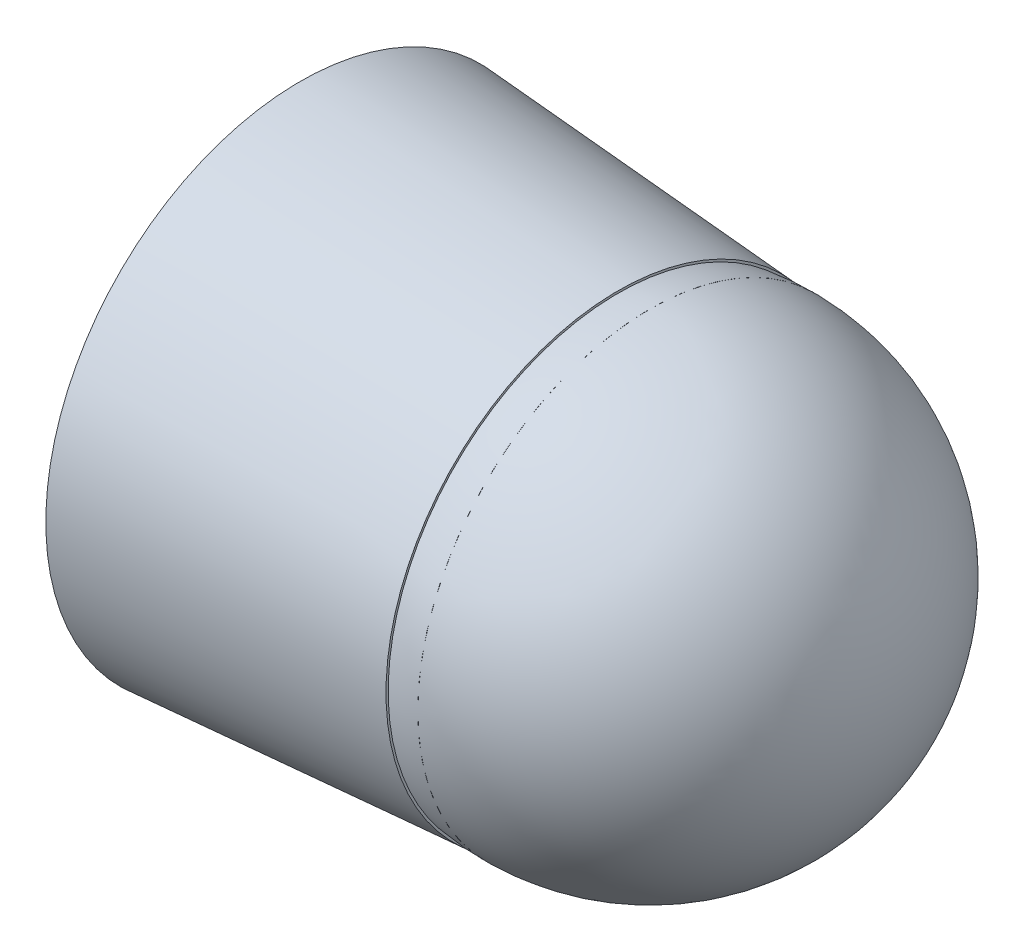
ISO-10303-21;
HEADER;
FILE_DESCRIPTION(('STEP AP214'),'2;1');
FILE_NAME('part.step','',(''),(''),'','','');
FILE_SCHEMA(('AUTOMOTIVE_DESIGN { 1 0 10303 214 1 1 1 1 }'));
ENDSEC;
DATA;
#1=APPLICATION_CONTEXT('core data for automotive mechanical design processes');
#2=APPLICATION_PROTOCOL_DEFINITION('international standard','automotive_design',2000,#1);
#3=PRODUCT_CONTEXT('',#1,'mechanical');
#4=PRODUCT('Part','Part','',(#3));
#5=PRODUCT_RELATED_PRODUCT_CATEGORY('part','',(#4));
#6=PRODUCT_DEFINITION_FORMATION('','',#4);
#7=PRODUCT_DEFINITION_CONTEXT('part definition',#1,'design');
#8=PRODUCT_DEFINITION('design','',#6,#7);
#9=PRODUCT_DEFINITION_SHAPE('','',#8);
#10=(LENGTH_UNIT() NAMED_UNIT(*) SI_UNIT(.MILLI.,.METRE.));
#11=(NAMED_UNIT(*) PLANE_ANGLE_UNIT() SI_UNIT($,.RADIAN.));
#12=(NAMED_UNIT(*) SI_UNIT($,.STERADIAN.) SOLID_ANGLE_UNIT());
#13=UNCERTAINTY_MEASURE_WITH_UNIT(LENGTH_MEASURE(1.E-05),#10,'distance_accuracy_value','');
#14=(GEOMETRIC_REPRESENTATION_CONTEXT(3) GLOBAL_UNCERTAINTY_ASSIGNED_CONTEXT((#13)) GLOBAL_UNIT_ASSIGNED_CONTEXT((#10,
#11,#12)) REPRESENTATION_CONTEXT('',''));
#15=CARTESIAN_POINT('',(0.,0.,0.));
#16=DIRECTION('',(0.,0.,1.));
#17=DIRECTION('',(1.,0.,0.));
#18=AXIS2_PLACEMENT_3D('',#15,#16,#17);
#19=CARTESIAN_POINT('',(11.,0.,0.));
#20=DIRECTION('',(1.,0.,0.));
#21=DIRECTION('',(0.,0.,-1.));
#22=AXIS2_PLACEMENT_3D('',#19,#20,#21);
#23=PLANE('',#22);
#24=CARTESIAN_POINT('',(11.,0.,0.));
#25=DIRECTION('',(1.,0.,0.));
#26=DIRECTION('',(0.,0.,-1.));
#27=AXIS2_PLACEMENT_3D('',#24,#25,#26);
#28=CIRCLE('',#27,7.30073188056489);
#29=CARTESIAN_POINT('',(11.,0.,-7.30073188056489));
#30=VERTEX_POINT('',#29);
#31=EDGE_CURVE('E11',#30,#30,#28,.T.);
#32=ORIENTED_EDGE('',*,*,#31,.T.);
#33=EDGE_LOOP('',(#32));
#34=FACE_BOUND('',#33,.T.);
#35=ADVANCED_FACE('F43',(#34),#23,.T.);
#36=OPEN_SHELL('',(#35));
#37=SHELL_BASED_SURFACE_MODEL('B2',(#36));
#38=CARTESIAN_POINT('',(10.,0.,0.));
#39=DIRECTION('',(1.,0.,0.));
#40=DIRECTION('',(0.,0.,-1.));
#41=AXIS2_PLACEMENT_3D('',#38,#39,#40);
#42=PLANE('',#41);
#43=CARTESIAN_POINT('',(10.,0.,0.));
#44=DIRECTION('',(1.,0.,0.));
#45=DIRECTION('',(0.,0.,-1.));
#46=AXIS2_PLACEMENT_3D('',#43,#44,#45);
#47=CIRCLE('',#46,7.30073188056489);
#48=CARTESIAN_POINT('',(10.,0.,-7.30073188056489));
#49=VERTEX_POINT('',#48);
#50=EDGE_CURVE('E42',#49,#49,#47,.T.);
#51=ORIENTED_EDGE('',*,*,#50,.T.);
#52=EDGE_LOOP('',(#51));
#53=FACE_BOUND('',#52,.T.);
#54=CARTESIAN_POINT('',(10.,0.,0.));
#55=DIRECTION('',(1.,0.,0.));
#56=DIRECTION('',(0.,0.,-1.));
#57=AXIS2_PLACEMENT_3D('',#54,#55,#56);
#58=CIRCLE('',#57,7.23192132091442);
#59=CARTESIAN_POINT('',(10.,0.,-7.23192132091442));
#60=VERTEX_POINT('',#59);
#61=EDGE_CURVE('E64',#60,#60,#58,.F.);
#62=ORIENTED_EDGE('',*,*,#61,.T.);
#63=EDGE_LOOP('',(#62));
#64=FACE_BOUND('',#63,.T.);
#65=ADVANCED_FACE('F60',(#53,#64),#42,.T.);
#66=CARTESIAN_POINT('',(0.,0.,0.));
#67=DIRECTION('',(-1.,0.,0.));
#68=DIRECTION('',(0.,0.,-1.));
#69=AXIS2_PLACEMENT_3D('',#66,#67,#68);
#70=CONICAL_SURFACE('',#69,8.,0.0698131700797732);
#71=ORIENTED_EDGE('',*,*,#50,.F.);
#72=EDGE_LOOP('',(#71));
#73=FACE_BOUND('',#72,.T.);
#74=CARTESIAN_POINT('',(0.,0.,0.));
#75=DIRECTION('',(1.,0.,0.));
#76=DIRECTION('',(0.,0.,-1.));
#77=AXIS2_PLACEMENT_3D('',#74,#75,#76);
#78=CIRCLE('',#77,8.);
#79=CARTESIAN_POINT('',(0.,0.,-8.));
#80=VERTEX_POINT('',#79);
#81=EDGE_CURVE('E68',#80,#80,#78,.T.);
#82=ORIENTED_EDGE('',*,*,#81,.T.);
#83=EDGE_LOOP('',(#82));
#84=FACE_BOUND('',#83,.T.);
#85=ADVANCED_FACE('F62',(#73,#84),#70,.T.);
#86=CARTESIAN_POINT('',(0.,0.,0.));
#87=DIRECTION('',(1.,0.,0.));
#88=DIRECTION('',(0.,0.,-1.));
#89=AXIS2_PLACEMENT_3D('',#86,#87,#88);
#90=PLANE('',#89);
#91=ORIENTED_EDGE('',*,*,#81,.F.);
#92=EDGE_LOOP('',(#91));
#93=FACE_BOUND('',#92,.T.);
#94=ADVANCED_FACE('F81',(#93),#90,.F.);
#95=CARTESIAN_POINT('',(11.,0.,0.));
#96=DIRECTION('',(0.,1.,0.));
#97=DIRECTION('',(0.,0.,-1.));
#98=AXIS2_PLACEMENT_3D('',#95,#96,#97);
#99=SPHERICAL_SURFACE('',#98,7.30073188056489);
#100=CARTESIAN_POINT('',(11.,0.,0.));
#101=DIRECTION('',(1.,0.,0.));
#102=DIRECTION('',(0.,0.,-1.));
#103=AXIS2_PLACEMENT_3D('',#100,#101,#102);
#104=SPHERICAL_SURFACE('',#103,7.30073188056489);
#105=ORIENTED_EDGE('',*,*,#61,.F.);
#106=EDGE_LOOP('',(#105));
#107=FACE_BOUND('',#106,.T.);
#108=ADVANCED_FACE('F79',(#107),#104,.T.);
#109=CLOSED_SHELL('',(#65,#85,#94,#108));
#110=MANIFOLD_SOLID_BREP('B6',#109);
#111=ADVANCED_BREP_SHAPE_REPRESENTATION('',(#18,#110),#14);
#112=MANIFOLD_SURFACE_SHAPE_REPRESENTATION('',(#18,#37),#14);
#113=SHAPE_REPRESENTATION('',(#18),#14);
#114=SHAPE_DEFINITION_REPRESENTATION(#9,#113);
#115=SHAPE_REPRESENTATION_RELATIONSHIP('','',#113,#111);
#116=SHAPE_REPRESENTATION_RELATIONSHIP('','',#113,#112);
ENDSEC;
END-ISO-10303-21;
